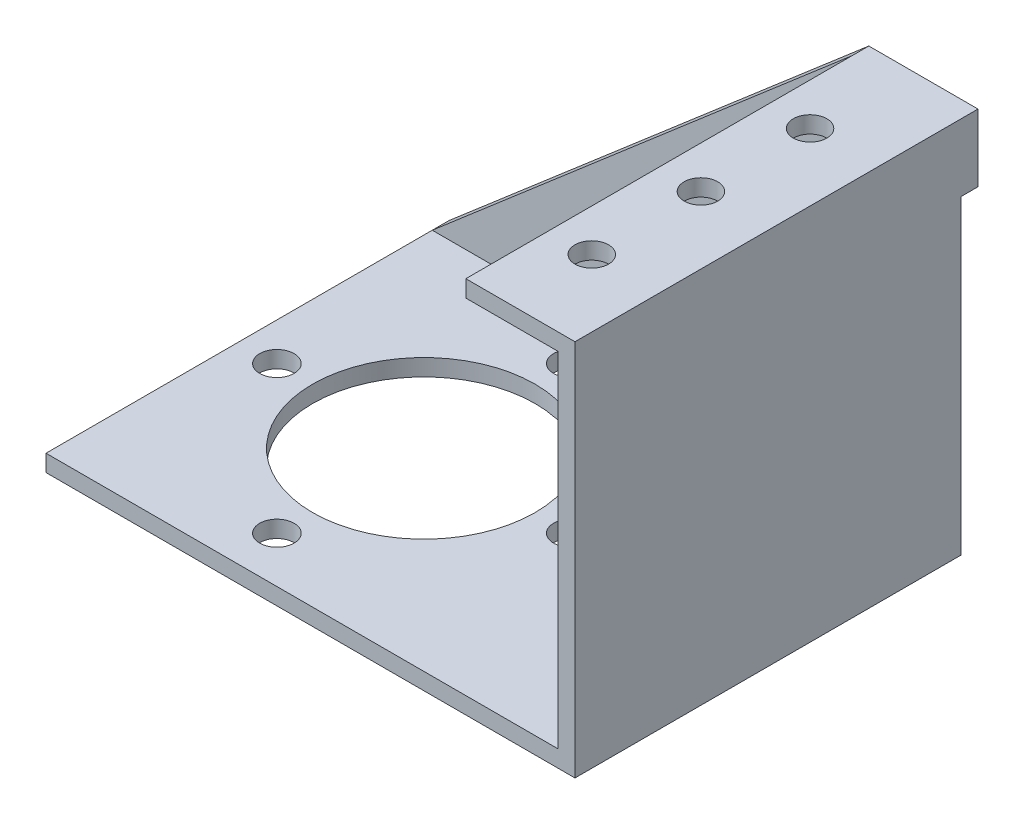
ISO-10303-21;
HEADER;
FILE_DESCRIPTION(('STEP AP214'),'2;1');
FILE_NAME('part.step','',(''),(''),'','','');
FILE_SCHEMA(('AUTOMOTIVE_DESIGN { 1 0 10303 214 1 1 1 1 }'));
ENDSEC;
DATA;
#1=APPLICATION_CONTEXT('core data for automotive mechanical design processes');
#2=APPLICATION_PROTOCOL_DEFINITION('international standard','automotive_design',2000,#1);
#3=PRODUCT_CONTEXT('',#1,'mechanical');
#4=PRODUCT('Part','Part','',(#3));
#5=PRODUCT_RELATED_PRODUCT_CATEGORY('part','',(#4));
#6=PRODUCT_DEFINITION_FORMATION('','',#4);
#7=PRODUCT_DEFINITION_CONTEXT('part definition',#1,'design');
#8=PRODUCT_DEFINITION('design','',#6,#7);
#9=PRODUCT_DEFINITION_SHAPE('','',#8);
#10=(LENGTH_UNIT() NAMED_UNIT(*) SI_UNIT(.MILLI.,.METRE.));
#11=(NAMED_UNIT(*) PLANE_ANGLE_UNIT() SI_UNIT($,.RADIAN.));
#12=(NAMED_UNIT(*) SI_UNIT($,.STERADIAN.) SOLID_ANGLE_UNIT());
#13=UNCERTAINTY_MEASURE_WITH_UNIT(LENGTH_MEASURE(1.E-05),#10,'distance_accuracy_value','');
#14=(GEOMETRIC_REPRESENTATION_CONTEXT(3) GLOBAL_UNCERTAINTY_ASSIGNED_CONTEXT((#13)) GLOBAL_UNIT_ASSIGNED_CONTEXT((#10,
#11,#12)) REPRESENTATION_CONTEXT('',''));
#15=CARTESIAN_POINT('',(0.,0.,0.));
#16=DIRECTION('',(0.,0.,1.));
#17=DIRECTION('',(1.,0.,0.));
#18=AXIS2_PLACEMENT_3D('',#15,#16,#17);
#19=CARTESIAN_POINT('',(0.,0.,0.));
#20=DIRECTION('',(0.,0.,1.));
#21=DIRECTION('',(1.,0.,0.));
#22=AXIS2_PLACEMENT_3D('',#19,#20,#21);
#23=PLANE('',#22);
#24=DIRECTION('',(-0.758185196311683,-0.652039268828047,0.));
#25=VECTOR('',#24,1.);
#26=CARTESIAN_POINT('',(0.,36.98,0.));
#27=LINE('',#26,#25);
#28=CARTESIAN_POINT('',(0.,36.98,0.));
#29=VERTEX_POINT('',#28);
#30=CARTESIAN_POINT('',(-2.,35.26,0.));
#31=VERTEX_POINT('',#30);
#32=EDGE_CURVE('E50',#29,#31,#27,.T.);
#33=ORIENTED_EDGE('',*,*,#32,.F.);
#34=DIRECTION('',(0.,1.,0.));
#35=VECTOR('',#34,1.);
#36=CARTESIAN_POINT('',(0.,0.,0.));
#37=LINE('',#36,#35);
#38=CARTESIAN_POINT('',(0.,0.,0.));
#39=VERTEX_POINT('',#38);
#40=EDGE_CURVE('E256',#39,#29,#37,.T.);
#41=ORIENTED_EDGE('',*,*,#40,.F.);
#42=DIRECTION('',(1.,0.,0.));
#43=VECTOR('',#42,1.);
#44=CARTESIAN_POINT('',(-63.,0.,0.));
#45=LINE('',#44,#43);
#46=CARTESIAN_POINT('',(-43.,0.,0.));
#47=VERTEX_POINT('',#46);
#48=EDGE_CURVE('E234',#47,#39,#45,.T.);
#49=ORIENTED_EDGE('',*,*,#48,.F.);
#50=CARTESIAN_POINT('',(-40.6744186046512,2.,0.));
#51=VERTEX_POINT('',#50);
#52=EDGE_CURVE('E11',#51,#47,#27,.T.);
#53=ORIENTED_EDGE('',*,*,#52,.F.);
#54=DIRECTION('',(-1.,0.,0.));
#55=VECTOR('',#54,1.);
#56=CARTESIAN_POINT('',(-1.99999999999999,2.00000000000001,0.));
#57=LINE('',#56,#55);
#58=CARTESIAN_POINT('',(-1.99999999999999,2.00000000000001,0.));
#59=VERTEX_POINT('',#58);
#60=EDGE_CURVE('E241',#59,#51,#57,.T.);
#61=ORIENTED_EDGE('',*,*,#60,.F.);
#62=DIRECTION('',(0.,-1.,0.));
#63=VECTOR('',#62,1.);
#64=CARTESIAN_POINT('',(-2.,43.,0.));
#65=LINE('',#64,#63);
#66=EDGE_CURVE('E262',#31,#59,#65,.T.);
#67=ORIENTED_EDGE('',*,*,#66,.F.);
#68=EDGE_LOOP('',(#33,#41,#49,#53,#61,#67));
#69=FACE_BOUND('',#68,.T.);
#70=ADVANCED_FACE('F39',(#69),#23,.F.);
#71=CARTESIAN_POINT('',(-63.,0.,46.));
#72=DIRECTION('',(0.,1.,0.));
#73=DIRECTION('',(0.,0.,1.));
#74=AXIS2_PLACEMENT_3D('',#71,#72,#73);
#75=PLANE('',#74);
#76=CARTESIAN_POINT('',(-8.,0.,10.));
#77=DIRECTION('',(0.,1.,0.));
#78=DIRECTION('',(0.,0.,1.));
#79=AXIS2_PLACEMENT_3D('',#76,#77,#78);
#80=CIRCLE('',#79,2.);
#81=CARTESIAN_POINT('',(-8.,0.,12.));
#82=VERTEX_POINT('',#81);
#83=EDGE_CURVE('E203',#82,#82,#80,.T.);
#84=ORIENTED_EDGE('',*,*,#83,.T.);
#85=EDGE_LOOP('',(#84));
#86=FACE_BOUND('',#85,.T.);
#87=CARTESIAN_POINT('',(-8.,0.,23.));
#88=DIRECTION('',(0.,1.,0.));
#89=DIRECTION('',(0.,0.,1.));
#90=AXIS2_PLACEMENT_3D('',#87,#88,#89);
#91=CIRCLE('',#90,2.);
#92=CARTESIAN_POINT('',(-8.,0.,25.));
#93=VERTEX_POINT('',#92);
#94=EDGE_CURVE('E197',#93,#93,#91,.T.);
#95=ORIENTED_EDGE('',*,*,#94,.T.);
#96=EDGE_LOOP('',(#95));
#97=FACE_BOUND('',#96,.T.);
#98=CARTESIAN_POINT('',(-8.,0.,36.));
#99=DIRECTION('',(0.,1.,0.));
#100=DIRECTION('',(0.,0.,1.));
#101=AXIS2_PLACEMENT_3D('',#98,#99,#100);
#102=CIRCLE('',#101,2.);
#103=CARTESIAN_POINT('',(-8.,0.,38.));
#104=VERTEX_POINT('',#103);
#105=EDGE_CURVE('E190',#104,#104,#102,.T.);
#106=ORIENTED_EDGE('',*,*,#105,.T.);
#107=EDGE_LOOP('',(#106));
#108=FACE_BOUND('',#107,.T.);
#109=CARTESIAN_POINT('',(-41.,0.,40.5));
#110=DIRECTION('',(0.,-1.,0.));
#111=DIRECTION('',(0.,0.,-1.));
#112=AXIS2_PLACEMENT_3D('',#109,#110,#111);
#113=CIRCLE('',#112,2.04999999999999);
#114=CARTESIAN_POINT('',(-41.,0.,38.45));
#115=VERTEX_POINT('',#114);
#116=EDGE_CURVE('E223',#115,#115,#113,.T.);
#117=ORIENTED_EDGE('',*,*,#116,.F.);
#118=EDGE_LOOP('',(#117));
#119=FACE_BOUND('',#118,.T.);
#120=CARTESIAN_POINT('',(-58.5,0.,23.));
#121=DIRECTION('',(0.,-1.,0.));
#122=DIRECTION('',(0.,0.,-1.));
#123=AXIS2_PLACEMENT_3D('',#120,#121,#122);
#124=CIRCLE('',#123,2.04999999999999);
#125=CARTESIAN_POINT('',(-58.5,0.,20.95));
#126=VERTEX_POINT('',#125);
#127=EDGE_CURVE('E210',#126,#126,#124,.T.);
#128=ORIENTED_EDGE('',*,*,#127,.F.);
#129=EDGE_LOOP('',(#128));
#130=FACE_BOUND('',#129,.T.);
#131=CARTESIAN_POINT('',(-23.5,0.,23.));
#132=DIRECTION('',(0.,-1.,0.));
#133=DIRECTION('',(0.,0.,-1.));
#134=AXIS2_PLACEMENT_3D('',#131,#132,#133);
#135=CIRCLE('',#134,2.05);
#136=CARTESIAN_POINT('',(-23.5,0.,20.95));
#137=VERTEX_POINT('',#136);
#138=EDGE_CURVE('E211',#137,#137,#135,.T.);
#139=ORIENTED_EDGE('',*,*,#138,.F.);
#140=EDGE_LOOP('',(#139));
#141=FACE_BOUND('',#140,.T.);
#142=CARTESIAN_POINT('',(-41.,0.,5.5));
#143=DIRECTION('',(0.,-1.,0.));
#144=DIRECTION('',(0.,0.,-1.));
#145=AXIS2_PLACEMENT_3D('',#142,#143,#144);
#146=CIRCLE('',#145,2.04999999999999);
#147=CARTESIAN_POINT('',(-41.,0.,3.45));
#148=VERTEX_POINT('',#147);
#149=EDGE_CURVE('E206',#148,#148,#146,.T.);
#150=ORIENTED_EDGE('',*,*,#149,.F.);
#151=EDGE_LOOP('',(#150));
#152=FACE_BOUND('',#151,.T.);
#153=CARTESIAN_POINT('',(-41.,0.,23.));
#154=DIRECTION('',(0.,-1.,0.));
#155=DIRECTION('',(0.,0.,-1.));
#156=AXIS2_PLACEMENT_3D('',#153,#154,#155);
#157=CIRCLE('',#156,13.25);
#158=CARTESIAN_POINT('',(-41.,0.,9.75));
#159=VERTEX_POINT('',#158);
#160=EDGE_CURVE('E222',#159,#159,#157,.T.);
#161=ORIENTED_EDGE('',*,*,#160,.F.);
#162=EDGE_LOOP('',(#161));
#163=FACE_BOUND('',#162,.T.);
#164=DIRECTION('',(0.,0.,-1.));
#165=VECTOR('',#164,1.);
#166=CARTESIAN_POINT('',(-63.,0.,46.));
#167=LINE('',#166,#165);
#168=CARTESIAN_POINT('',(-63.,0.,46.));
#169=VERTEX_POINT('',#168);
#170=CARTESIAN_POINT('',(-63.,0.,-2.));
#171=VERTEX_POINT('',#170);
#172=EDGE_CURVE('E254',#169,#171,#167,.T.);
#173=ORIENTED_EDGE('',*,*,#172,.T.);
#174=DIRECTION('',(-1.,0.,0.));
#175=VECTOR('',#174,1.);
#176=CARTESIAN_POINT('',(-43.,0.,-2.));
#177=LINE('',#176,#175);
#178=CARTESIAN_POINT('',(-43.,0.,-2.));
#179=VERTEX_POINT('',#178);
#180=EDGE_CURVE('E162',#179,#171,#177,.T.);
#181=ORIENTED_EDGE('',*,*,#180,.F.);
#182=DIRECTION('',(0.,0.,1.));
#183=VECTOR('',#182,1.);
#184=CARTESIAN_POINT('',(-43.,0.,-2.));
#185=LINE('',#184,#183);
#186=EDGE_CURVE('E173',#179,#47,#185,.T.);
#187=ORIENTED_EDGE('',*,*,#186,.T.);
#188=ORIENTED_EDGE('',*,*,#48,.T.);
#189=DIRECTION('',(0.,0.,-1.));
#190=VECTOR('',#189,1.);
#191=CARTESIAN_POINT('',(0.,0.,46.));
#192=LINE('',#191,#190);
#193=CARTESIAN_POINT('',(0.,0.,46.));
#194=VERTEX_POINT('',#193);
#195=EDGE_CURVE('E48',#194,#39,#192,.T.);
#196=ORIENTED_EDGE('',*,*,#195,.F.);
#197=DIRECTION('',(1.,0.,0.));
#198=VECTOR('',#197,1.);
#199=CARTESIAN_POINT('',(-63.,0.,46.));
#200=LINE('',#199,#198);
#201=EDGE_CURVE('E237',#169,#194,#200,.T.);
#202=ORIENTED_EDGE('',*,*,#201,.F.);
#203=EDGE_LOOP('',(#173,#181,#187,#188,#196,#202));
#204=FACE_BOUND('',#203,.T.);
#205=ADVANCED_FACE('F41',(#86,#97,#108,#119,#130,#141,#152,#163,#204),#75,.F.);
#206=CARTESIAN_POINT('',(0.,0.,46.));
#207=DIRECTION('',(-1.,0.,0.));
#208=DIRECTION('',(0.,0.,1.));
#209=AXIS2_PLACEMENT_3D('',#206,#207,#208);
#210=PLANE('',#209);
#211=ORIENTED_EDGE('',*,*,#40,.T.);
#212=DIRECTION('',(0.,0.,1.));
#213=VECTOR('',#212,1.);
#214=CARTESIAN_POINT('',(0.,36.98,-2.));
#215=LINE('',#214,#213);
#216=CARTESIAN_POINT('',(0.,36.98,-2.));
#217=VERTEX_POINT('',#216);
#218=EDGE_CURVE('E147',#217,#29,#215,.T.);
#219=ORIENTED_EDGE('',*,*,#218,.F.);
#220=DIRECTION('',(0.,-1.,0.));
#221=VECTOR('',#220,1.);
#222=CARTESIAN_POINT('',(0.,45.,-2.));
#223=LINE('',#222,#221);
#224=CARTESIAN_POINT('',(0.,45.,-2.));
#225=VERTEX_POINT('',#224);
#226=EDGE_CURVE('E144',#225,#217,#223,.T.);
#227=ORIENTED_EDGE('',*,*,#226,.F.);
#228=DIRECTION('',(0.,0.,-1.));
#229=VECTOR('',#228,1.);
#230=CARTESIAN_POINT('',(0.,45.,46.));
#231=LINE('',#230,#229);
#232=CARTESIAN_POINT('',(0.,45.,46.));
#233=VERTEX_POINT('',#232);
#234=EDGE_CURVE('E132',#233,#225,#231,.T.);
#235=ORIENTED_EDGE('',*,*,#234,.F.);
#236=DIRECTION('',(0.,1.,0.));
#237=VECTOR('',#236,1.);
#238=CARTESIAN_POINT('',(0.,0.,46.));
#239=LINE('',#238,#237);
#240=EDGE_CURVE('E240',#194,#233,#239,.T.);
#241=ORIENTED_EDGE('',*,*,#240,.F.);
#242=ORIENTED_EDGE('',*,*,#195,.T.);
#243=EDGE_LOOP('',(#211,#219,#227,#235,#241,#242));
#244=FACE_BOUND('',#243,.T.);
#245=ADVANCED_FACE('F145',(#244),#210,.F.);
#246=CARTESIAN_POINT('',(0.,45.,46.));
#247=DIRECTION('',(0.,-1.,0.));
#248=DIRECTION('',(0.,0.,-1.));
#249=AXIS2_PLACEMENT_3D('',#246,#247,#248);
#250=PLANE('',#249);
#251=CARTESIAN_POINT('',(-8.,45.,10.));
#252=DIRECTION('',(0.,1.,0.));
#253=DIRECTION('',(0.,0.,1.));
#254=AXIS2_PLACEMENT_3D('',#251,#252,#253);
#255=CIRCLE('',#254,2.);
#256=CARTESIAN_POINT('',(-8.,45.,12.));
#257=VERTEX_POINT('',#256);
#258=EDGE_CURVE('E178',#257,#257,#255,.T.);
#259=ORIENTED_EDGE('',*,*,#258,.F.);
#260=EDGE_LOOP('',(#259));
#261=FACE_BOUND('',#260,.T.);
#262=CARTESIAN_POINT('',(-8.,45.,23.));
#263=DIRECTION('',(0.,1.,0.));
#264=DIRECTION('',(0.,0.,1.));
#265=AXIS2_PLACEMENT_3D('',#262,#263,#264);
#266=CIRCLE('',#265,2.);
#267=CARTESIAN_POINT('',(-8.,45.,25.));
#268=VERTEX_POINT('',#267);
#269=EDGE_CURVE('E182',#268,#268,#266,.T.);
#270=ORIENTED_EDGE('',*,*,#269,.F.);
#271=EDGE_LOOP('',(#270));
#272=FACE_BOUND('',#271,.T.);
#273=CARTESIAN_POINT('',(-8.,45.,36.));
#274=DIRECTION('',(0.,1.,0.));
#275=DIRECTION('',(0.,0.,1.));
#276=AXIS2_PLACEMENT_3D('',#273,#274,#275);
#277=CIRCLE('',#276,2.);
#278=CARTESIAN_POINT('',(-8.,45.,38.));
#279=VERTEX_POINT('',#278);
#280=EDGE_CURVE('E177',#279,#279,#277,.T.);
#281=ORIENTED_EDGE('',*,*,#280,.F.);
#282=EDGE_LOOP('',(#281));
#283=FACE_BOUND('',#282,.T.);
#284=ORIENTED_EDGE('',*,*,#234,.T.);
#285=DIRECTION('',(1.,0.,0.));
#286=VECTOR('',#285,1.);
#287=CARTESIAN_POINT('',(0.,45.,-2.));
#288=LINE('',#287,#286);
#289=CARTESIAN_POINT('',(-13.,45.,-2.));
#290=VERTEX_POINT('',#289);
#291=EDGE_CURVE('E137',#290,#225,#288,.T.);
#292=ORIENTED_EDGE('',*,*,#291,.F.);
#293=DIRECTION('',(0.,0.,1.));
#294=VECTOR('',#293,1.);
#295=CARTESIAN_POINT('',(-13.,45.,-2.));
#296=LINE('',#295,#294);
#297=CARTESIAN_POINT('',(-13.,45.,0.));
#298=VERTEX_POINT('',#297);
#299=EDGE_CURVE('E167',#290,#298,#296,.T.);
#300=ORIENTED_EDGE('',*,*,#299,.T.);
#301=DIRECTION('',(0.,0.,-1.));
#302=VECTOR('',#301,1.);
#303=CARTESIAN_POINT('',(-13.,45.,46.));
#304=LINE('',#303,#302);
#305=CARTESIAN_POINT('',(-13.,45.,46.));
#306=VERTEX_POINT('',#305);
#307=EDGE_CURVE('E141',#306,#298,#304,.T.);
#308=ORIENTED_EDGE('',*,*,#307,.F.);
#309=DIRECTION('',(-1.,0.,0.));
#310=VECTOR('',#309,1.);
#311=CARTESIAN_POINT('',(0.,45.,46.));
#312=LINE('',#311,#310);
#313=EDGE_CURVE('E139',#233,#306,#312,.T.);
#314=ORIENTED_EDGE('',*,*,#313,.F.);
#315=EDGE_LOOP('',(#284,#292,#300,#308,#314));
#316=FACE_BOUND('',#315,.T.);
#317=ADVANCED_FACE('F134',(#261,#272,#283,#316),#250,.F.);
#318=CARTESIAN_POINT('',(-13.,45.,46.));
#319=DIRECTION('',(1.,0.,0.));
#320=DIRECTION('',(0.,0.,-1.));
#321=AXIS2_PLACEMENT_3D('',#318,#319,#320);
#322=PLANE('',#321);
#323=DIRECTION('',(0.,-1.,0.));
#324=VECTOR('',#323,1.);
#325=CARTESIAN_POINT('',(-13.,45.,0.));
#326=LINE('',#325,#324);
#327=CARTESIAN_POINT('',(-13.,43.,0.));
#328=VERTEX_POINT('',#327);
#329=EDGE_CURVE('E258',#298,#328,#326,.T.);
#330=ORIENTED_EDGE('',*,*,#329,.T.);
#331=DIRECTION('',(0.,0.,-1.));
#332=VECTOR('',#331,1.);
#333=CARTESIAN_POINT('',(-13.,43.,46.));
#334=LINE('',#333,#332);
#335=CARTESIAN_POINT('',(-13.,43.,46.));
#336=VERTEX_POINT('',#335);
#337=EDGE_CURVE('E277',#336,#328,#334,.T.);
#338=ORIENTED_EDGE('',*,*,#337,.F.);
#339=DIRECTION('',(0.,-1.,0.));
#340=VECTOR('',#339,1.);
#341=CARTESIAN_POINT('',(-13.,45.,46.));
#342=LINE('',#341,#340);
#343=EDGE_CURVE('E244',#306,#336,#342,.T.);
#344=ORIENTED_EDGE('',*,*,#343,.F.);
#345=ORIENTED_EDGE('',*,*,#307,.T.);
#346=EDGE_LOOP('',(#330,#338,#344,#345));
#347=FACE_BOUND('',#346,.T.);
#348=ADVANCED_FACE('F332',(#347),#322,.F.);
#349=CARTESIAN_POINT('',(-13.,43.,46.));
#350=DIRECTION('',(0.,1.,0.));
#351=DIRECTION('',(0.,0.,1.));
#352=AXIS2_PLACEMENT_3D('',#349,#350,#351);
#353=PLANE('',#352);
#354=CARTESIAN_POINT('',(-8.,43.,10.));
#355=DIRECTION('',(0.,1.,0.));
#356=DIRECTION('',(0.,0.,1.));
#357=AXIS2_PLACEMENT_3D('',#354,#355,#356);
#358=CIRCLE('',#357,2.);
#359=CARTESIAN_POINT('',(-8.,43.,12.));
#360=VERTEX_POINT('',#359);
#361=EDGE_CURVE('E200',#360,#360,#358,.T.);
#362=ORIENTED_EDGE('',*,*,#361,.T.);
#363=EDGE_LOOP('',(#362));
#364=FACE_BOUND('',#363,.T.);
#365=CARTESIAN_POINT('',(-8.,43.,23.));
#366=DIRECTION('',(0.,1.,0.));
#367=DIRECTION('',(0.,0.,1.));
#368=AXIS2_PLACEMENT_3D('',#365,#366,#367);
#369=CIRCLE('',#368,2.);
#370=CARTESIAN_POINT('',(-8.,43.,25.));
#371=VERTEX_POINT('',#370);
#372=EDGE_CURVE('E194',#371,#371,#369,.T.);
#373=ORIENTED_EDGE('',*,*,#372,.T.);
#374=EDGE_LOOP('',(#373));
#375=FACE_BOUND('',#374,.T.);
#376=CARTESIAN_POINT('',(-8.,43.,36.));
#377=DIRECTION('',(0.,1.,0.));
#378=DIRECTION('',(0.,0.,1.));
#379=AXIS2_PLACEMENT_3D('',#376,#377,#378);
#380=CIRCLE('',#379,2.);
#381=CARTESIAN_POINT('',(-8.,43.,38.));
#382=VERTEX_POINT('',#381);
#383=EDGE_CURVE('E187',#382,#382,#380,.T.);
#384=ORIENTED_EDGE('',*,*,#383,.T.);
#385=EDGE_LOOP('',(#384));
#386=FACE_BOUND('',#385,.T.);
#387=DIRECTION('',(1.,0.,0.));
#388=VECTOR('',#387,1.);
#389=CARTESIAN_POINT('',(-13.,43.,0.));
#390=LINE('',#389,#388);
#391=CARTESIAN_POINT('',(-2.,43.,0.));
#392=VERTEX_POINT('',#391);
#393=EDGE_CURVE('E260',#328,#392,#390,.T.);
#394=ORIENTED_EDGE('',*,*,#393,.T.);
#395=DIRECTION('',(0.,0.,-1.));
#396=VECTOR('',#395,1.);
#397=CARTESIAN_POINT('',(-2.,43.,46.));
#398=LINE('',#397,#396);
#399=CARTESIAN_POINT('',(-2.,43.,46.));
#400=VERTEX_POINT('',#399);
#401=EDGE_CURVE('E274',#400,#392,#398,.T.);
#402=ORIENTED_EDGE('',*,*,#401,.F.);
#403=DIRECTION('',(1.,0.,0.));
#404=VECTOR('',#403,1.);
#405=CARTESIAN_POINT('',(-13.,43.,46.));
#406=LINE('',#405,#404);
#407=EDGE_CURVE('E246',#336,#400,#406,.T.);
#408=ORIENTED_EDGE('',*,*,#407,.F.);
#409=ORIENTED_EDGE('',*,*,#337,.T.);
#410=EDGE_LOOP('',(#394,#402,#408,#409));
#411=FACE_BOUND('',#410,.T.);
#412=ADVANCED_FACE('F354',(#364,#375,#386,#411),#353,.F.);
#413=CARTESIAN_POINT('',(-2.,43.,46.));
#414=DIRECTION('',(1.,0.,0.));
#415=DIRECTION('',(0.,1.,0.));
#416=AXIS2_PLACEMENT_3D('',#413,#414,#415);
#417=PLANE('',#416);
#418=EDGE_CURVE('E263',#392,#31,#65,.T.);
#419=ORIENTED_EDGE('',*,*,#418,.T.);
#420=ORIENTED_EDGE('',*,*,#66,.T.);
#421=DIRECTION('',(0.,0.,-1.));
#422=VECTOR('',#421,1.);
#423=CARTESIAN_POINT('',(-1.99999999999999,2.00000000000001,46.));
#424=LINE('',#423,#422);
#425=CARTESIAN_POINT('',(-1.99999999999999,2.00000000000001,46.));
#426=VERTEX_POINT('',#425);
#427=EDGE_CURVE('E271',#426,#59,#424,.T.);
#428=ORIENTED_EDGE('',*,*,#427,.F.);
#429=DIRECTION('',(0.,-1.,0.));
#430=VECTOR('',#429,1.);
#431=CARTESIAN_POINT('',(-2.,43.,46.));
#432=LINE('',#431,#430);
#433=EDGE_CURVE('E248',#400,#426,#432,.T.);
#434=ORIENTED_EDGE('',*,*,#433,.F.);
#435=ORIENTED_EDGE('',*,*,#401,.T.);
#436=EDGE_LOOP('',(#419,#420,#428,#434,#435));
#437=FACE_BOUND('',#436,.T.);
#438=ADVANCED_FACE('F350',(#437),#417,.F.);
#439=CARTESIAN_POINT('',(-1.99999999999999,2.00000000000001,46.));
#440=DIRECTION('',(0.,-1.,0.));
#441=DIRECTION('',(1.,0.,0.));
#442=AXIS2_PLACEMENT_3D('',#439,#440,#441);
#443=PLANE('',#442);
#444=CARTESIAN_POINT('',(-8.,2.00000000000001,10.));
#445=DIRECTION('',(0.,-1.,0.));
#446=DIRECTION('',(1.,0.,0.));
#447=AXIS2_PLACEMENT_3D('',#444,#445,#446);
#448=CIRCLE('',#447,2.);
#449=CARTESIAN_POINT('',(-6.,2.00000000000001,10.));
#450=VERTEX_POINT('',#449);
#451=EDGE_CURVE('E43',#450,#450,#448,.T.);
#452=ORIENTED_EDGE('',*,*,#451,.T.);
#453=EDGE_LOOP('',(#452));
#454=FACE_BOUND('',#453,.T.);
#455=CARTESIAN_POINT('',(-8.,2.00000000000001,23.));
#456=DIRECTION('',(0.,-1.,0.));
#457=DIRECTION('',(1.,0.,0.));
#458=AXIS2_PLACEMENT_3D('',#455,#456,#457);
#459=CIRCLE('',#458,2.);
#460=CARTESIAN_POINT('',(-6.,2.00000000000001,23.));
#461=VERTEX_POINT('',#460);
#462=EDGE_CURVE('E193',#461,#461,#459,.T.);
#463=ORIENTED_EDGE('',*,*,#462,.T.);
#464=EDGE_LOOP('',(#463));
#465=FACE_BOUND('',#464,.T.);
#466=CARTESIAN_POINT('',(-8.,2.00000000000001,36.));
#467=DIRECTION('',(0.,-1.,0.));
#468=DIRECTION('',(1.,0.,0.));
#469=AXIS2_PLACEMENT_3D('',#466,#467,#468);
#470=CIRCLE('',#469,2.);
#471=CARTESIAN_POINT('',(-5.99999999999999,2.00000000000001,36.));
#472=VERTEX_POINT('',#471);
#473=EDGE_CURVE('E181',#472,#472,#470,.T.);
#474=ORIENTED_EDGE('',*,*,#473,.T.);
#475=EDGE_LOOP('',(#474));
#476=FACE_BOUND('',#475,.T.);
#477=CARTESIAN_POINT('',(-41.,2.,40.5));
#478=DIRECTION('',(0.,-1.,0.));
#479=DIRECTION('',(0.,0.,-1.));
#480=AXIS2_PLACEMENT_3D('',#477,#478,#479);
#481=CIRCLE('',#480,2.04999999999999);
#482=CARTESIAN_POINT('',(-41.,2.,38.45));
#483=VERTEX_POINT('',#482);
#484=EDGE_CURVE('E219',#483,#483,#481,.T.);
#485=ORIENTED_EDGE('',*,*,#484,.T.);
#486=EDGE_LOOP('',(#485));
#487=FACE_BOUND('',#486,.T.);
#488=CARTESIAN_POINT('',(-58.5,2.,23.));
#489=DIRECTION('',(0.,-1.,0.));
#490=DIRECTION('',(0.,0.,-1.));
#491=AXIS2_PLACEMENT_3D('',#488,#489,#490);
#492=CIRCLE('',#491,2.04999999999999);
#493=CARTESIAN_POINT('',(-58.5,2.,20.95));
#494=VERTEX_POINT('',#493);
#495=EDGE_CURVE('E226',#494,#494,#492,.T.);
#496=ORIENTED_EDGE('',*,*,#495,.T.);
#497=EDGE_LOOP('',(#496));
#498=FACE_BOUND('',#497,.T.);
#499=CARTESIAN_POINT('',(-23.5,2.,23.));
#500=DIRECTION('',(0.,-1.,0.));
#501=DIRECTION('',(0.,0.,-1.));
#502=AXIS2_PLACEMENT_3D('',#499,#500,#501);
#503=CIRCLE('',#502,2.05);
#504=CARTESIAN_POINT('',(-23.5,2.,20.95));
#505=VERTEX_POINT('',#504);
#506=EDGE_CURVE('E207',#505,#505,#503,.T.);
#507=ORIENTED_EDGE('',*,*,#506,.T.);
#508=EDGE_LOOP('',(#507));
#509=FACE_BOUND('',#508,.T.);
#510=CARTESIAN_POINT('',(-41.,2.,5.5));
#511=DIRECTION('',(0.,-1.,0.));
#512=DIRECTION('',(0.,0.,-1.));
#513=AXIS2_PLACEMENT_3D('',#510,#511,#512);
#514=CIRCLE('',#513,2.04999999999999);
#515=CARTESIAN_POINT('',(-41.,2.,3.45));
#516=VERTEX_POINT('',#515);
#517=EDGE_CURVE('E214',#516,#516,#514,.T.);
#518=ORIENTED_EDGE('',*,*,#517,.T.);
#519=EDGE_LOOP('',(#518));
#520=FACE_BOUND('',#519,.T.);
#521=CARTESIAN_POINT('',(-41.,2.,23.));
#522=DIRECTION('',(0.,-1.,0.));
#523=DIRECTION('',(0.,0.,-1.));
#524=AXIS2_PLACEMENT_3D('',#521,#522,#523);
#525=CIRCLE('',#524,13.25);
#526=CARTESIAN_POINT('',(-41.,2.,9.75));
#527=VERTEX_POINT('',#526);
#528=EDGE_CURVE('E231',#527,#527,#525,.T.);
#529=ORIENTED_EDGE('',*,*,#528,.T.);
#530=EDGE_LOOP('',(#529));
#531=FACE_BOUND('',#530,.T.);
#532=ORIENTED_EDGE('',*,*,#60,.T.);
#533=CARTESIAN_POINT('',(-63.,2.,0.));
#534=VERTEX_POINT('',#533);
#535=EDGE_CURVE('E265',#51,#534,#57,.T.);
#536=ORIENTED_EDGE('',*,*,#535,.T.);
#537=DIRECTION('',(0.,0.,-1.));
#538=VECTOR('',#537,1.);
#539=CARTESIAN_POINT('',(-63.,2.,46.));
#540=LINE('',#539,#538);
#541=CARTESIAN_POINT('',(-63.,2.,46.));
#542=VERTEX_POINT('',#541);
#543=EDGE_CURVE('E268',#542,#534,#540,.T.);
#544=ORIENTED_EDGE('',*,*,#543,.F.);
#545=DIRECTION('',(-1.,0.,0.));
#546=VECTOR('',#545,1.);
#547=CARTESIAN_POINT('',(-1.99999999999999,2.00000000000001,46.));
#548=LINE('',#547,#546);
#549=EDGE_CURVE('E250',#426,#542,#548,.T.);
#550=ORIENTED_EDGE('',*,*,#549,.F.);
#551=ORIENTED_EDGE('',*,*,#427,.T.);
#552=EDGE_LOOP('',(#532,#536,#544,#550,#551));
#553=FACE_BOUND('',#552,.T.);
#554=ADVANCED_FACE('F287',(#454,#465,#476,#487,#498,#509,#520,#531,#553),#443,.F.);
#555=CARTESIAN_POINT('',(-63.,2.,46.));
#556=DIRECTION('',(1.,0.,0.));
#557=DIRECTION('',(0.,1.,0.));
#558=AXIS2_PLACEMENT_3D('',#555,#556,#557);
#559=PLANE('',#558);
#560=ORIENTED_EDGE('',*,*,#543,.T.);
#561=DIRECTION('',(0.,0.,1.));
#562=VECTOR('',#561,1.);
#563=CARTESIAN_POINT('',(-63.,2.,-2.));
#564=LINE('',#563,#562);
#565=CARTESIAN_POINT('',(-63.,2.,-2.));
#566=VERTEX_POINT('',#565);
#567=EDGE_CURVE('E170',#566,#534,#564,.T.);
#568=ORIENTED_EDGE('',*,*,#567,.F.);
#569=DIRECTION('',(0.,1.,0.));
#570=VECTOR('',#569,1.);
#571=CARTESIAN_POINT('',(-63.,2.,-2.));
#572=LINE('',#571,#570);
#573=EDGE_CURVE('E165',#171,#566,#572,.T.);
#574=ORIENTED_EDGE('',*,*,#573,.F.);
#575=ORIENTED_EDGE('',*,*,#172,.F.);
#576=DIRECTION('',(0.,-1.,0.));
#577=VECTOR('',#576,1.);
#578=CARTESIAN_POINT('',(-63.,2.,46.));
#579=LINE('',#578,#577);
#580=EDGE_CURVE('E252',#542,#169,#579,.T.);
#581=ORIENTED_EDGE('',*,*,#580,.F.);
#582=EDGE_LOOP('',(#560,#568,#574,#575,#581));
#583=FACE_BOUND('',#582,.T.);
#584=ADVANCED_FACE('F323',(#583),#559,.F.);
#585=CARTESIAN_POINT('',(0.,0.,46.));
#586=DIRECTION('',(0.,0.,1.));
#587=DIRECTION('',(1.,0.,0.));
#588=AXIS2_PLACEMENT_3D('',#585,#586,#587);
#589=PLANE('',#588);
#590=ORIENTED_EDGE('',*,*,#201,.T.);
#591=ORIENTED_EDGE('',*,*,#240,.T.);
#592=ORIENTED_EDGE('',*,*,#313,.T.);
#593=ORIENTED_EDGE('',*,*,#343,.T.);
#594=ORIENTED_EDGE('',*,*,#407,.T.);
#595=ORIENTED_EDGE('',*,*,#433,.T.);
#596=ORIENTED_EDGE('',*,*,#549,.T.);
#597=ORIENTED_EDGE('',*,*,#580,.T.);
#598=EDGE_LOOP('',(#590,#591,#592,#593,#594,#595,#596,#597));
#599=FACE_BOUND('',#598,.T.);
#600=ADVANCED_FACE('F335',(#599),#589,.T.);
#601=CARTESIAN_POINT('',(-41.,2.,23.));
#602=DIRECTION('',(0.,-1.,0.));
#603=DIRECTION('',(0.,0.,-1.));
#604=AXIS2_PLACEMENT_3D('',#601,#602,#603);
#605=CYLINDRICAL_SURFACE('',#604,13.25);
#606=ORIENTED_EDGE('',*,*,#528,.F.);
#607=EDGE_LOOP('',(#606));
#608=FACE_BOUND('',#607,.T.);
#609=ORIENTED_EDGE('',*,*,#160,.T.);
#610=EDGE_LOOP('',(#609));
#611=FACE_BOUND('',#610,.T.);
#612=ADVANCED_FACE('F525',(#608,#611),#605,.F.);
#613=CARTESIAN_POINT('',(-41.,2.,5.5));
#614=DIRECTION('',(0.,-1.,0.));
#615=DIRECTION('',(0.,0.,-1.));
#616=AXIS2_PLACEMENT_3D('',#613,#614,#615);
#617=CYLINDRICAL_SURFACE('',#616,2.04999999999999);
#618=ORIENTED_EDGE('',*,*,#517,.F.);
#619=EDGE_LOOP('',(#618));
#620=FACE_BOUND('',#619,.T.);
#621=ORIENTED_EDGE('',*,*,#149,.T.);
#622=EDGE_LOOP('',(#621));
#623=FACE_BOUND('',#622,.T.);
#624=ADVANCED_FACE('F516',(#620,#623),#617,.F.);
#625=CARTESIAN_POINT('',(-23.5,2.,23.));
#626=DIRECTION('',(0.,-1.,0.));
#627=DIRECTION('',(0.,0.,-1.));
#628=AXIS2_PLACEMENT_3D('',#625,#626,#627);
#629=CYLINDRICAL_SURFACE('',#628,2.05);
#630=ORIENTED_EDGE('',*,*,#506,.F.);
#631=EDGE_LOOP('',(#630));
#632=FACE_BOUND('',#631,.T.);
#633=ORIENTED_EDGE('',*,*,#138,.T.);
#634=EDGE_LOOP('',(#633));
#635=FACE_BOUND('',#634,.T.);
#636=ADVANCED_FACE('F507',(#632,#635),#629,.F.);
#637=CARTESIAN_POINT('',(-58.5,2.,23.));
#638=DIRECTION('',(0.,-1.,0.));
#639=DIRECTION('',(0.,0.,-1.));
#640=AXIS2_PLACEMENT_3D('',#637,#638,#639);
#641=CYLINDRICAL_SURFACE('',#640,2.04999999999999);
#642=ORIENTED_EDGE('',*,*,#495,.F.);
#643=EDGE_LOOP('',(#642));
#644=FACE_BOUND('',#643,.T.);
#645=ORIENTED_EDGE('',*,*,#127,.T.);
#646=EDGE_LOOP('',(#645));
#647=FACE_BOUND('',#646,.T.);
#648=ADVANCED_FACE('F498',(#644,#647),#641,.F.);
#649=CARTESIAN_POINT('',(-41.,2.,40.5));
#650=DIRECTION('',(0.,-1.,0.));
#651=DIRECTION('',(0.,0.,-1.));
#652=AXIS2_PLACEMENT_3D('',#649,#650,#651);
#653=CYLINDRICAL_SURFACE('',#652,2.04999999999999);
#654=ORIENTED_EDGE('',*,*,#484,.F.);
#655=EDGE_LOOP('',(#654));
#656=FACE_BOUND('',#655,.T.);
#657=ORIENTED_EDGE('',*,*,#116,.T.);
#658=EDGE_LOOP('',(#657));
#659=FACE_BOUND('',#658,.T.);
#660=ADVANCED_FACE('F381',(#656,#659),#653,.F.);
#661=CARTESIAN_POINT('',(-8.,-55.,36.));
#662=DIRECTION('',(0.,1.,0.));
#663=DIRECTION('',(0.,0.,1.));
#664=AXIS2_PLACEMENT_3D('',#661,#662,#663);
#665=CYLINDRICAL_SURFACE('',#664,2.);
#666=ORIENTED_EDGE('',*,*,#473,.F.);
#667=EDGE_LOOP('',(#666));
#668=FACE_BOUND('',#667,.T.);
#669=ORIENTED_EDGE('',*,*,#105,.F.);
#670=EDGE_LOOP('',(#669));
#671=FACE_BOUND('',#670,.T.);
#672=ADVANCED_FACE('F294',(#668,#671),#665,.F.);
#673=CARTESIAN_POINT('',(-8.,-55.,23.));
#674=DIRECTION('',(0.,1.,0.));
#675=DIRECTION('',(0.,0.,1.));
#676=AXIS2_PLACEMENT_3D('',#673,#674,#675);
#677=CYLINDRICAL_SURFACE('',#676,2.);
#678=ORIENTED_EDGE('',*,*,#462,.F.);
#679=EDGE_LOOP('',(#678));
#680=FACE_BOUND('',#679,.T.);
#681=ORIENTED_EDGE('',*,*,#94,.F.);
#682=EDGE_LOOP('',(#681));
#683=FACE_BOUND('',#682,.T.);
#684=ADVANCED_FACE('F290',(#680,#683),#677,.F.);
#685=CARTESIAN_POINT('',(-8.,-55.,10.));
#686=DIRECTION('',(0.,1.,0.));
#687=DIRECTION('',(0.,0.,1.));
#688=AXIS2_PLACEMENT_3D('',#685,#686,#687);
#689=CYLINDRICAL_SURFACE('',#688,2.);
#690=ORIENTED_EDGE('',*,*,#451,.F.);
#691=EDGE_LOOP('',(#690));
#692=FACE_BOUND('',#691,.T.);
#693=ORIENTED_EDGE('',*,*,#83,.F.);
#694=EDGE_LOOP('',(#693));
#695=FACE_BOUND('',#694,.T.);
#696=ADVANCED_FACE('F293',(#692,#695),#689,.F.);
#697=ORIENTED_EDGE('',*,*,#280,.T.);
#698=EDGE_LOOP('',(#697));
#699=FACE_BOUND('',#698,.T.);
#700=ORIENTED_EDGE('',*,*,#383,.F.);
#701=EDGE_LOOP('',(#700));
#702=FACE_BOUND('',#701,.T.);
#703=ADVANCED_FACE('F384',(#699,#702),#665,.F.);
#704=ORIENTED_EDGE('',*,*,#269,.T.);
#705=EDGE_LOOP('',(#704));
#706=FACE_BOUND('',#705,.T.);
#707=ORIENTED_EDGE('',*,*,#372,.F.);
#708=EDGE_LOOP('',(#707));
#709=FACE_BOUND('',#708,.T.);
#710=ADVANCED_FACE('F296',(#706,#709),#677,.F.);
#711=ORIENTED_EDGE('',*,*,#258,.T.);
#712=EDGE_LOOP('',(#711));
#713=FACE_BOUND('',#712,.T.);
#714=ORIENTED_EDGE('',*,*,#361,.F.);
#715=EDGE_LOOP('',(#714));
#716=FACE_BOUND('',#715,.T.);
#717=ADVANCED_FACE('F398',(#713,#716),#689,.F.);
#718=CARTESIAN_POINT('',(0.,0.,0.));
#719=DIRECTION('',(0.,0.,1.));
#720=DIRECTION('',(1.,0.,0.));
#721=AXIS2_PLACEMENT_3D('',#718,#719,#720);
#722=PLANE('',#721);
#723=ORIENTED_EDGE('',*,*,#535,.F.);
#724=EDGE_CURVE('E51',#31,#51,#27,.T.);
#725=ORIENTED_EDGE('',*,*,#724,.F.);
#726=ORIENTED_EDGE('',*,*,#418,.F.);
#727=ORIENTED_EDGE('',*,*,#393,.F.);
#728=ORIENTED_EDGE('',*,*,#329,.F.);
#729=DIRECTION('',(0.758185196311683,0.652039268828047,0.));
#730=VECTOR('',#729,1.);
#731=CARTESIAN_POINT('',(-13.,45.,0.));
#732=LINE('',#731,#730);
#733=EDGE_CURVE('E156',#534,#298,#732,.T.);
#734=ORIENTED_EDGE('',*,*,#733,.F.);
#735=EDGE_LOOP('',(#723,#725,#726,#727,#728,#734));
#736=FACE_BOUND('',#735,.T.);
#737=ADVANCED_FACE('F415',(#736),#722,.T.);
#738=CARTESIAN_POINT('',(0.,36.98,-2.));
#739=DIRECTION('',(-0.652039268828047,0.758185196311683,0.));
#740=DIRECTION('',(-0.758185196311683,-0.652039268828047,0.));
#741=AXIS2_PLACEMENT_3D('',#738,#739,#740);
#742=PLANE('',#741);
#743=ORIENTED_EDGE('',*,*,#32,.T.);
#744=ORIENTED_EDGE('',*,*,#724,.T.);
#745=ORIENTED_EDGE('',*,*,#52,.T.);
#746=ORIENTED_EDGE('',*,*,#186,.F.);
#747=DIRECTION('',(-0.758185196311683,-0.652039268828047,0.));
#748=VECTOR('',#747,1.);
#749=CARTESIAN_POINT('',(0.,36.98,-2.));
#750=LINE('',#749,#748);
#751=EDGE_CURVE('E150',#217,#179,#750,.T.);
#752=ORIENTED_EDGE('',*,*,#751,.F.);
#753=ORIENTED_EDGE('',*,*,#218,.T.);
#754=EDGE_LOOP('',(#743,#744,#745,#746,#752,#753));
#755=FACE_BOUND('',#754,.T.);
#756=ADVANCED_FACE('F421',(#755),#742,.F.);
#757=CARTESIAN_POINT('',(-13.,45.,-2.));
#758=DIRECTION('',(0.652039268828047,-0.758185196311683,0.));
#759=DIRECTION('',(0.758185196311683,0.652039268828047,0.));
#760=AXIS2_PLACEMENT_3D('',#757,#758,#759);
#761=PLANE('',#760);
#762=ORIENTED_EDGE('',*,*,#733,.T.);
#763=ORIENTED_EDGE('',*,*,#299,.F.);
#764=DIRECTION('',(0.758185196311683,0.652039268828047,0.));
#765=VECTOR('',#764,1.);
#766=CARTESIAN_POINT('',(-13.,45.,-2.));
#767=LINE('',#766,#765);
#768=EDGE_CURVE('E154',#566,#290,#767,.T.);
#769=ORIENTED_EDGE('',*,*,#768,.F.);
#770=ORIENTED_EDGE('',*,*,#567,.T.);
#771=EDGE_LOOP('',(#762,#763,#769,#770));
#772=FACE_BOUND('',#771,.T.);
#773=ADVANCED_FACE('F327',(#772),#761,.F.);
#774=CARTESIAN_POINT('',(0.,0.,-2.));
#775=DIRECTION('',(0.,0.,1.));
#776=DIRECTION('',(1.,0.,0.));
#777=AXIS2_PLACEMENT_3D('',#774,#775,#776);
#778=PLANE('',#777);
#779=ORIENTED_EDGE('',*,*,#291,.T.);
#780=ORIENTED_EDGE('',*,*,#226,.T.);
#781=ORIENTED_EDGE('',*,*,#751,.T.);
#782=ORIENTED_EDGE('',*,*,#180,.T.);
#783=ORIENTED_EDGE('',*,*,#573,.T.);
#784=ORIENTED_EDGE('',*,*,#768,.T.);
#785=EDGE_LOOP('',(#779,#780,#781,#782,#783,#784));
#786=FACE_BOUND('',#785,.T.);
#787=ADVANCED_FACE('F152',(#786),#778,.F.);
#788=CLOSED_SHELL('',(#70,#205,#245,#317,#348,#412,#438,#554,#584,#600,#612,#624,#636,#648,#660,
#672,#684,#696,#703,#710,#717,#737,#756,#773,#787));
#789=MANIFOLD_SOLID_BREP('B2',#788);
#790=ADVANCED_BREP_SHAPE_REPRESENTATION('',(#18,#789),#14);
#791=SHAPE_DEFINITION_REPRESENTATION(#9,#790);
ENDSEC;
END-ISO-10303-21;
